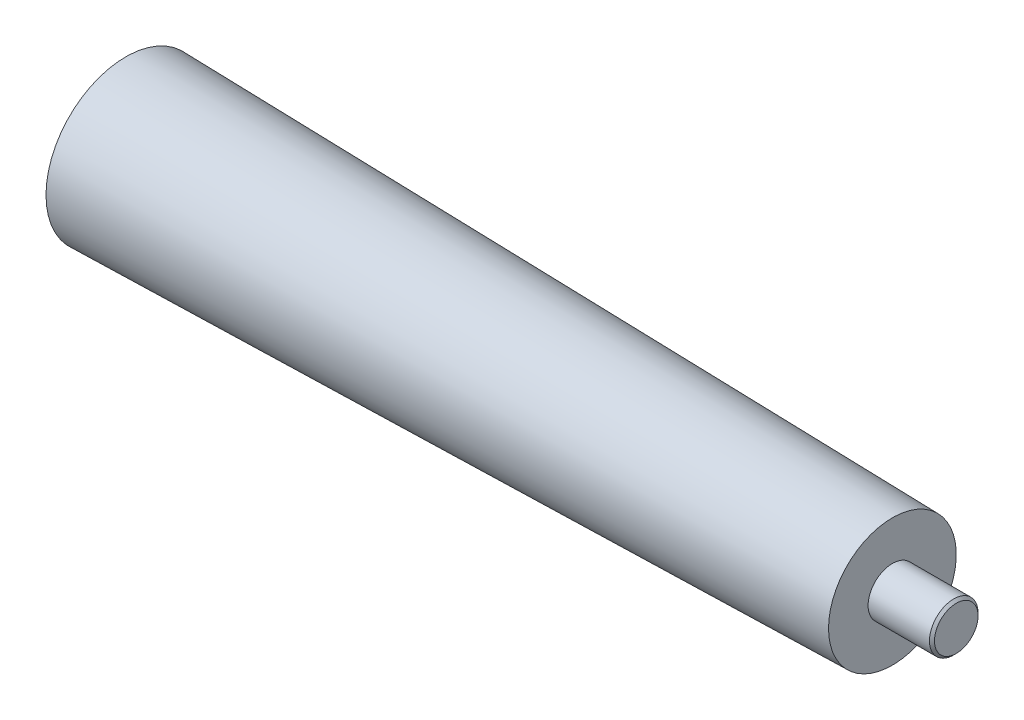
ISO-10303-21;
HEADER;
FILE_DESCRIPTION(('STEP AP214'),'2;1');
FILE_NAME('part.step','',(''),(''),'','','');
FILE_SCHEMA(('AUTOMOTIVE_DESIGN { 1 0 10303 214 1 1 1 1 }'));
ENDSEC;
DATA;
#1=APPLICATION_CONTEXT('core data for automotive mechanical design processes');
#2=APPLICATION_PROTOCOL_DEFINITION('international standard','automotive_design',2000,#1);
#3=PRODUCT_CONTEXT('',#1,'mechanical');
#4=PRODUCT('Part','Part','',(#3));
#5=PRODUCT_RELATED_PRODUCT_CATEGORY('part','',(#4));
#6=PRODUCT_DEFINITION_FORMATION('','',#4);
#7=PRODUCT_DEFINITION_CONTEXT('part definition',#1,'design');
#8=PRODUCT_DEFINITION('design','',#6,#7);
#9=PRODUCT_DEFINITION_SHAPE('','',#8);
#10=(LENGTH_UNIT() NAMED_UNIT(*) SI_UNIT(.MILLI.,.METRE.));
#11=(NAMED_UNIT(*) PLANE_ANGLE_UNIT() SI_UNIT($,.RADIAN.));
#12=(NAMED_UNIT(*) SI_UNIT($,.STERADIAN.) SOLID_ANGLE_UNIT());
#13=UNCERTAINTY_MEASURE_WITH_UNIT(LENGTH_MEASURE(1.E-05),#10,'distance_accuracy_value','');
#14=(GEOMETRIC_REPRESENTATION_CONTEXT(3) GLOBAL_UNCERTAINTY_ASSIGNED_CONTEXT((#13)) GLOBAL_UNIT_ASSIGNED_CONTEXT((#10,
#11,#12)) REPRESENTATION_CONTEXT('',''));
#15=CARTESIAN_POINT('',(0.,0.,0.));
#16=DIRECTION('',(0.,0.,1.));
#17=DIRECTION('',(1.,0.,0.));
#18=AXIS2_PLACEMENT_3D('',#15,#16,#17);
#19=CARTESIAN_POINT('',(0.,0.,-15.88));
#20=DIRECTION('',(1.,0.,0.));
#21=DIRECTION('',(0.,0.,-1.));
#22=AXIS2_PLACEMENT_3D('',#19,#20,#21);
#23=PLANE('',#22);
#24=CARTESIAN_POINT('',(0.,0.,0.));
#25=DIRECTION('',(-1.,0.,0.));
#26=DIRECTION('',(0.,0.,1.));
#27=AXIS2_PLACEMENT_3D('',#24,#25,#26);
#28=CIRCLE('',#27,15.88);
#29=CARTESIAN_POINT('',(0.,0.,15.88));
#30=VERTEX_POINT('',#29);
#31=EDGE_CURVE('E68',#30,#30,#28,.T.);
#32=ORIENTED_EDGE('',*,*,#31,.T.);
#33=EDGE_LOOP('',(#32));
#34=FACE_BOUND('',#33,.T.);
#35=ADVANCED_FACE('F43',(#34),#23,.F.);
#36=CARTESIAN_POINT('',(165.1,0.,0.));
#37=DIRECTION('',(-1.,0.,0.));
#38=DIRECTION('',(0.,0.,1.));
#39=AXIS2_PLACEMENT_3D('',#36,#37,#38);
#40=PLANE('',#39);
#41=CARTESIAN_POINT('',(165.1,0.,0.));
#42=DIRECTION('',(-1.,0.,0.));
#43=DIRECTION('',(0.,0.,1.));
#44=AXIS2_PLACEMENT_3D('',#41,#42,#43);
#45=CIRCLE('',#44,4.32999999999997);
#46=CARTESIAN_POINT('',(165.1,0.,4.32999999999997));
#47=VERTEX_POINT('',#46);
#48=EDGE_CURVE('E10',#47,#47,#45,.F.);
#49=ORIENTED_EDGE('',*,*,#48,.T.);
#50=EDGE_LOOP('',(#49));
#51=FACE_BOUND('',#50,.T.);
#52=ADVANCED_FACE('F88',(#51),#40,.F.);
#53=CARTESIAN_POINT('',(0.,0.,0.));
#54=DIRECTION('',(-1.,0.,0.));
#55=DIRECTION('',(0.,0.,1.));
#56=AXIS2_PLACEMENT_3D('',#53,#54,#55);
#57=CYLINDRICAL_SURFACE('',#56,4.83);
#58=CARTESIAN_POINT('',(164.6,0.,0.));
#59=DIRECTION('',(-1.,0.,0.));
#60=DIRECTION('',(0.,0.,1.));
#61=AXIS2_PLACEMENT_3D('',#58,#59,#60);
#62=CIRCLE('',#61,4.83);
#63=CARTESIAN_POINT('',(164.6,0.,4.83));
#64=VERTEX_POINT('',#63);
#65=EDGE_CURVE('E52',#64,#64,#62,.T.);
#66=ORIENTED_EDGE('',*,*,#65,.T.);
#67=EDGE_LOOP('',(#66));
#68=FACE_BOUND('',#67,.T.);
#69=CARTESIAN_POINT('',(152.4,0.,0.));
#70=DIRECTION('',(-1.,0.,0.));
#71=DIRECTION('',(0.,0.,1.));
#72=AXIS2_PLACEMENT_3D('',#69,#70,#71);
#73=CIRCLE('',#72,4.83);
#74=CARTESIAN_POINT('',(152.4,0.,4.83));
#75=VERTEX_POINT('',#74);
#76=EDGE_CURVE('E57',#75,#75,#73,.T.);
#77=ORIENTED_EDGE('',*,*,#76,.F.);
#78=EDGE_LOOP('',(#77));
#79=FACE_BOUND('',#78,.T.);
#80=ADVANCED_FACE('F83',(#68,#79),#57,.T.);
#81=CARTESIAN_POINT('',(152.4,0.,-4.83));
#82=DIRECTION('',(-1.,0.,0.));
#83=DIRECTION('',(0.,0.,1.));
#84=AXIS2_PLACEMENT_3D('',#81,#82,#83);
#85=PLANE('',#84);
#86=CARTESIAN_POINT('',(152.4,0.,0.));
#87=DIRECTION('',(-1.,0.,0.));
#88=DIRECTION('',(0.,0.,1.));
#89=AXIS2_PLACEMENT_3D('',#86,#87,#88);
#90=CIRCLE('',#89,12.7);
#91=CARTESIAN_POINT('',(152.4,0.,12.7));
#92=VERTEX_POINT('',#91);
#93=EDGE_CURVE('E62',#92,#92,#90,.T.);
#94=ORIENTED_EDGE('',*,*,#93,.F.);
#95=EDGE_LOOP('',(#94));
#96=FACE_BOUND('',#95,.T.);
#97=ORIENTED_EDGE('',*,*,#76,.T.);
#98=EDGE_LOOP('',(#97));
#99=FACE_BOUND('',#98,.T.);
#100=ADVANCED_FACE('F77',(#96,#99),#85,.F.);
#101=CARTESIAN_POINT('',(152.4,0.,0.));
#102=DIRECTION('',(-1.,0.,0.));
#103=DIRECTION('',(0.,0.,1.));
#104=AXIS2_PLACEMENT_3D('',#101,#102,#103);
#105=CONICAL_SURFACE('',#104,12.7,0.0208631141791714);
#106=ORIENTED_EDGE('',*,*,#31,.F.);
#107=EDGE_LOOP('',(#106));
#108=FACE_BOUND('',#107,.T.);
#109=ORIENTED_EDGE('',*,*,#93,.T.);
#110=EDGE_LOOP('',(#109));
#111=FACE_BOUND('',#110,.T.);
#112=ADVANCED_FACE('F74',(#108,#111),#105,.T.);
#113=CARTESIAN_POINT('',(164.6,0.,0.));
#114=DIRECTION('',(-1.,0.,0.));
#115=DIRECTION('',(0.,0.,1.));
#116=AXIS2_PLACEMENT_3D('',#113,#114,#115);
#117=CONICAL_SURFACE('',#116,4.83,0.785398163397447);
#118=ORIENTED_EDGE('',*,*,#48,.F.);
#119=EDGE_LOOP('',(#118));
#120=FACE_BOUND('',#119,.T.);
#121=ORIENTED_EDGE('',*,*,#65,.F.);
#122=EDGE_LOOP('',(#121));
#123=FACE_BOUND('',#122,.T.);
#124=ADVANCED_FACE('F46',(#120,#123),#117,.T.);
#125=CLOSED_SHELL('',(#35,#52,#80,#100,#112,#124));
#126=MANIFOLD_SOLID_BREP('B2',#125);
#127=ADVANCED_BREP_SHAPE_REPRESENTATION('',(#18,#126),#14);
#128=SHAPE_DEFINITION_REPRESENTATION(#9,#127);
ENDSEC;
END-ISO-10303-21;
